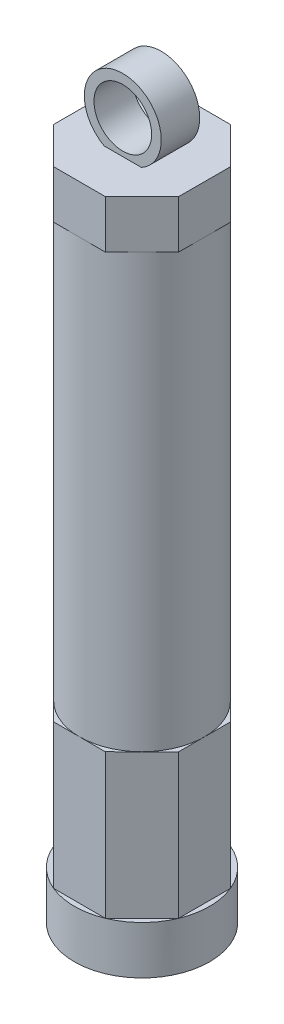
ISO-10303-21;
HEADER;
FILE_DESCRIPTION(('STEP AP214'),'2;1');
FILE_NAME('part.step','',(''),(''),'','','');
FILE_SCHEMA(('AUTOMOTIVE_DESIGN { 1 0 10303 214 1 1 1 1 }'));
ENDSEC;
DATA;
#1=APPLICATION_CONTEXT('core data for automotive mechanical design processes');
#2=APPLICATION_PROTOCOL_DEFINITION('international standard','automotive_design',2000,#1);
#3=PRODUCT_CONTEXT('',#1,'mechanical');
#4=PRODUCT('Part','Part','',(#3));
#5=PRODUCT_RELATED_PRODUCT_CATEGORY('part','',(#4));
#6=PRODUCT_DEFINITION_FORMATION('','',#4);
#7=PRODUCT_DEFINITION_CONTEXT('part definition',#1,'design');
#8=PRODUCT_DEFINITION('design','',#6,#7);
#9=PRODUCT_DEFINITION_SHAPE('','',#8);
#10=(LENGTH_UNIT() NAMED_UNIT(*) SI_UNIT(.MILLI.,.METRE.));
#11=(NAMED_UNIT(*) PLANE_ANGLE_UNIT() SI_UNIT($,.RADIAN.));
#12=(NAMED_UNIT(*) SI_UNIT($,.STERADIAN.) SOLID_ANGLE_UNIT());
#13=UNCERTAINTY_MEASURE_WITH_UNIT(LENGTH_MEASURE(1.E-05),#10,'distance_accuracy_value','');
#14=(GEOMETRIC_REPRESENTATION_CONTEXT(3) GLOBAL_UNCERTAINTY_ASSIGNED_CONTEXT((#13)) GLOBAL_UNIT_ASSIGNED_CONTEXT((#10,
#11,#12)) REPRESENTATION_CONTEXT('',''));
#15=CARTESIAN_POINT('',(0.,0.,0.));
#16=DIRECTION('',(0.,0.,1.));
#17=DIRECTION('',(1.,0.,0.));
#18=AXIS2_PLACEMENT_3D('',#15,#16,#17);
#19=CARTESIAN_POINT('',(0.,50.,0.));
#20=DIRECTION('',(0.,1.,0.));
#21=DIRECTION('',(0.,0.,1.));
#22=AXIS2_PLACEMENT_3D('',#19,#20,#21);
#23=PLANE('',#22);
#24=DIRECTION('',(0.999999236559649,0.,0.0012356699070069));
#25=VECTOR('',#24,1.);
#26=CARTESIAN_POINT('',(-2.70041795434292,50.,6.49666813461608));
#27=LINE('',#26,#25);
#28=CARTESIAN_POINT('',(-2.70041795434292,50.,6.49666813461608));
#29=VERTEX_POINT('',#28);
#30=CARTESIAN_POINT('',(2.6843542455518,50.,6.50332194065936));
#31=VERTEX_POINT('',#30);
#32=EDGE_CURVE('E317',#29,#31,#27,.T.);
#33=ORIENTED_EDGE('',*,*,#32,.T.);
#34=DIRECTION('',(0.707979991923252,0.,-0.706232490782145));
#35=VECTOR('',#34,1.);
#36=CARTESIAN_POINT('',(2.6843542455518,50.,6.50332194065936));
#37=LINE('',#36,#35);
#38=CARTESIAN_POINT('',(6.49666813461607,50.,2.70041795434291));
#39=VERTEX_POINT('',#38);
#40=EDGE_CURVE('E320',#31,#39,#37,.T.);
#41=ORIENTED_EDGE('',*,*,#40,.T.);
#42=DIRECTION('',(0.00123566990700835,0.,-0.999999236559649));
#43=VECTOR('',#42,1.);
#44=CARTESIAN_POINT('',(6.49666813461607,50.,2.70041795434291));
#45=LINE('',#44,#43);
#46=CARTESIAN_POINT('',(6.50332194065936,50.,-2.68435424555181));
#47=VERTEX_POINT('',#46);
#48=EDGE_CURVE('E323',#39,#47,#45,.T.);
#49=ORIENTED_EDGE('',*,*,#48,.T.);
#50=DIRECTION('',(-0.706232490782145,0.,-0.707979991923252));
#51=VECTOR('',#50,1.);
#52=CARTESIAN_POINT('',(6.50332194065936,50.,-2.68435424555181));
#53=LINE('',#52,#51);
#54=CARTESIAN_POINT('',(2.70041795434291,50.,-6.49666813461607));
#55=VERTEX_POINT('',#54);
#56=EDGE_CURVE('E325',#47,#55,#53,.T.);
#57=ORIENTED_EDGE('',*,*,#56,.T.);
#58=DIRECTION('',(-0.999999236559649,0.,-0.00123566990700852));
#59=VECTOR('',#58,1.);
#60=CARTESIAN_POINT('',(2.70041795434291,50.,-6.49666813461607));
#61=LINE('',#60,#59);
#62=CARTESIAN_POINT('',(-2.68435424555181,50.,-6.50332194065936));
#63=VERTEX_POINT('',#62);
#64=EDGE_CURVE('E327',#55,#63,#61,.T.);
#65=ORIENTED_EDGE('',*,*,#64,.T.);
#66=DIRECTION('',(-0.707979991923253,0.,0.706232490782144));
#67=VECTOR('',#66,1.);
#68=CARTESIAN_POINT('',(-2.68435424555181,50.,-6.50332194065936));
#69=LINE('',#68,#67);
#70=CARTESIAN_POINT('',(-6.49666813461608,50.,-2.70041795434292));
#71=VERTEX_POINT('',#70);
#72=EDGE_CURVE('E329',#63,#71,#69,.T.);
#73=ORIENTED_EDGE('',*,*,#72,.T.);
#74=DIRECTION('',(-0.00123566990700803,0.,0.999999236559649));
#75=VECTOR('',#74,1.);
#76=CARTESIAN_POINT('',(-6.49666813461608,50.,-2.70041795434292));
#77=LINE('',#76,#75);
#78=CARTESIAN_POINT('',(-6.50332194065937,50.,2.68435424555181));
#79=VERTEX_POINT('',#78);
#80=EDGE_CURVE('E331',#71,#79,#77,.T.);
#81=ORIENTED_EDGE('',*,*,#80,.T.);
#82=DIRECTION('',(0.706232490782145,0.,0.707979991923252));
#83=VECTOR('',#82,1.);
#84=CARTESIAN_POINT('',(-6.50332194065937,50.,2.68435424555181));
#85=LINE('',#84,#83);
#86=EDGE_CURVE('E333',#79,#29,#85,.T.);
#87=ORIENTED_EDGE('',*,*,#86,.T.);
#88=EDGE_LOOP('',(#33,#41,#49,#57,#65,#73,#81,#87));
#89=FACE_BOUND('',#88,.T.);
#90=DIRECTION('',(1.,0.,0.));
#91=VECTOR('',#90,1.);
#92=CARTESIAN_POINT('',(1.93649167310372,50.,-2.));
#93=LINE('',#92,#91);
#94=CARTESIAN_POINT('',(-1.93649167310372,50.,-2.));
#95=VERTEX_POINT('',#94);
#96=CARTESIAN_POINT('',(1.93649167310372,50.,-2.));
#97=VERTEX_POINT('',#96);
#98=EDGE_CURVE('E215',#95,#97,#93,.T.);
#99=ORIENTED_EDGE('',*,*,#98,.T.);
#100=DIRECTION('',(0.,0.,-1.));
#101=VECTOR('',#100,1.);
#102=CARTESIAN_POINT('',(1.93649167310372,50.,2.));
#103=LINE('',#102,#101);
#104=CARTESIAN_POINT('',(1.93649167310372,50.,2.));
#105=VERTEX_POINT('',#104);
#106=EDGE_CURVE('E223',#105,#97,#103,.T.);
#107=ORIENTED_EDGE('',*,*,#106,.F.);
#108=DIRECTION('',(1.,0.,0.));
#109=VECTOR('',#108,1.);
#110=CARTESIAN_POINT('',(1.93649167310372,50.,2.));
#111=LINE('',#110,#109);
#112=CARTESIAN_POINT('',(-1.93649167310372,50.,2.));
#113=VERTEX_POINT('',#112);
#114=EDGE_CURVE('E213',#113,#105,#111,.T.);
#115=ORIENTED_EDGE('',*,*,#114,.F.);
#116=DIRECTION('',(0.,0.,-1.));
#117=VECTOR('',#116,1.);
#118=CARTESIAN_POINT('',(-1.93649167310372,50.,2.));
#119=LINE('',#118,#117);
#120=EDGE_CURVE('E218',#113,#95,#119,.T.);
#121=ORIENTED_EDGE('',*,*,#120,.T.);
#122=EDGE_LOOP('',(#99,#107,#115,#121));
#123=FACE_BOUND('',#122,.T.);
#124=ADVANCED_FACE('F33',(#89,#123),#23,.T.);
#125=CARTESIAN_POINT('',(0.,45.,0.));
#126=DIRECTION('',(0.,-1.,0.));
#127=DIRECTION('',(0.,0.,-1.));
#128=AXIS2_PLACEMENT_3D('',#125,#126,#127);
#129=CYLINDRICAL_SURFACE('',#128,6.5);
#130=CARTESIAN_POINT('',(0.,45.,0.));
#131=DIRECTION('',(0.,1.,0.));
#132=DIRECTION('',(0.,0.,1.));
#133=AXIS2_PLACEMENT_3D('',#130,#131,#132);
#134=CIRCLE('',#133,6.5);
#135=CARTESIAN_POINT('',(4.59051119008394,45.,4.60186994750114));
#136=VERTEX_POINT('',#135);
#137=CARTESIAN_POINT('',(6.49999503763772,45.,0.0080318543955543));
#138=VERTEX_POINT('',#137);
#139=EDGE_CURVE('E11',#136,#138,#134,.T.);
#140=ORIENTED_EDGE('',*,*,#139,.F.);
#141=CARTESIAN_POINT('',(-0.00803185439554488,45.,6.49999503763772));
#142=VERTEX_POINT('',#141);
#143=EDGE_CURVE('E43',#142,#136,#134,.T.);
#144=ORIENTED_EDGE('',*,*,#143,.F.);
#145=CARTESIAN_POINT('',(-4.60186994750114,45.,4.59051119008395));
#146=VERTEX_POINT('',#145);
#147=EDGE_CURVE('E401',#146,#142,#134,.T.);
#148=ORIENTED_EDGE('',*,*,#147,.F.);
#149=CARTESIAN_POINT('',(-6.49999503763773,45.,-0.00803185439555221));
#150=VERTEX_POINT('',#149);
#151=EDGE_CURVE('E562',#150,#146,#134,.T.);
#152=ORIENTED_EDGE('',*,*,#151,.F.);
#153=CARTESIAN_POINT('',(-4.59051119008394,45.,-4.60186994750115));
#154=VERTEX_POINT('',#153);
#155=EDGE_CURVE('E585',#154,#150,#134,.T.);
#156=ORIENTED_EDGE('',*,*,#155,.F.);
#157=CARTESIAN_POINT('',(0.00803185439555535,45.,-6.49999503763772));
#158=VERTEX_POINT('',#157);
#159=EDGE_CURVE('E586',#158,#154,#134,.T.);
#160=ORIENTED_EDGE('',*,*,#159,.F.);
#161=CARTESIAN_POINT('',(4.60186994750114,45.,-4.59051119008394));
#162=VERTEX_POINT('',#161);
#163=EDGE_CURVE('E591',#162,#158,#134,.T.);
#164=ORIENTED_EDGE('',*,*,#163,.F.);
#165=EDGE_CURVE('E42',#138,#162,#134,.T.);
#166=ORIENTED_EDGE('',*,*,#165,.F.);
#167=EDGE_LOOP('',(#140,#144,#148,#152,#156,#160,#164,#166));
#168=FACE_BOUND('',#167,.T.);
#169=CARTESIAN_POINT('',(0.,0.,0.));
#170=DIRECTION('',(0.,1.,0.));
#171=DIRECTION('',(0.,0.,1.));
#172=AXIS2_PLACEMENT_3D('',#169,#170,#171);
#173=CIRCLE('',#172,6.5);
#174=CARTESIAN_POINT('',(4.59051119008394,0.,4.60186994750113));
#175=VERTEX_POINT('',#174);
#176=CARTESIAN_POINT('',(6.49999503763771,0.,0.00803185439555423));
#177=VERTEX_POINT('',#176);
#178=EDGE_CURVE('E37',#175,#177,#173,.T.);
#179=ORIENTED_EDGE('',*,*,#178,.T.);
#180=CARTESIAN_POINT('',(4.60186994750113,0.,-4.59051119008394));
#181=VERTEX_POINT('',#180);
#182=EDGE_CURVE('E397',#177,#181,#173,.T.);
#183=ORIENTED_EDGE('',*,*,#182,.T.);
#184=CARTESIAN_POINT('',(0.00803185439555336,0.,-6.49999503763771));
#185=VERTEX_POINT('',#184);
#186=EDGE_CURVE('E402',#181,#185,#173,.T.);
#187=ORIENTED_EDGE('',*,*,#186,.T.);
#188=CARTESIAN_POINT('',(-4.59051119008394,0.,-4.60186994750114));
#189=VERTEX_POINT('',#188);
#190=EDGE_CURVE('E404',#185,#189,#173,.T.);
#191=ORIENTED_EDGE('',*,*,#190,.T.);
#192=CARTESIAN_POINT('',(-6.49999503763771,0.,-0.0080318543955564));
#193=VERTEX_POINT('',#192);
#194=EDGE_CURVE('E406',#189,#193,#173,.T.);
#195=ORIENTED_EDGE('',*,*,#194,.T.);
#196=CARTESIAN_POINT('',(-4.60186994750115,0.,4.59051119008393));
#197=VERTEX_POINT('',#196);
#198=EDGE_CURVE('E396',#193,#197,#173,.T.);
#199=ORIENTED_EDGE('',*,*,#198,.T.);
#200=CARTESIAN_POINT('',(-0.00803185439553862,0.,6.49999503763772));
#201=VERTEX_POINT('',#200);
#202=EDGE_CURVE('E392',#197,#201,#173,.T.);
#203=ORIENTED_EDGE('',*,*,#202,.T.);
#204=EDGE_CURVE('E388',#201,#175,#173,.T.);
#205=ORIENTED_EDGE('',*,*,#204,.T.);
#206=EDGE_LOOP('',(#179,#183,#187,#191,#195,#199,#203,#205));
#207=FACE_BOUND('',#206,.T.);
#208=ADVANCED_FACE('F35',(#168,#207),#129,.T.);
#209=CARTESIAN_POINT('',(0.,45.,0.));
#210=DIRECTION('',(0.,1.,0.));
#211=DIRECTION('',(0.,0.,1.));
#212=AXIS2_PLACEMENT_3D('',#209,#210,#211);
#213=PLANE('',#212);
#214=DIRECTION('',(0.707979991923252,0.,-0.706232490782145));
#215=VECTOR('',#214,1.);
#216=CARTESIAN_POINT('',(2.6843542455518,45.,6.50332194065936));
#217=LINE('',#216,#215);
#218=CARTESIAN_POINT('',(6.49666813461607,45.,2.70041795434291));
#219=VERTEX_POINT('',#218);
#220=EDGE_CURVE('E339',#136,#219,#217,.T.);
#221=ORIENTED_EDGE('',*,*,#220,.F.);
#222=ORIENTED_EDGE('',*,*,#139,.T.);
#223=DIRECTION('',(0.00123566990700835,0.,-0.999999236559649));
#224=VECTOR('',#223,1.);
#225=CARTESIAN_POINT('',(6.49666813461607,45.,2.70041795434291));
#226=LINE('',#225,#224);
#227=EDGE_CURVE('E344',#219,#138,#226,.T.);
#228=ORIENTED_EDGE('',*,*,#227,.F.);
#229=EDGE_LOOP('',(#221,#222,#228));
#230=FACE_BOUND('',#229,.T.);
#231=ADVANCED_FACE('F509',(#230),#213,.F.);
#232=CARTESIAN_POINT('',(6.50332194065936,45.,-2.68435424555181));
#233=VERTEX_POINT('',#232);
#234=EDGE_CURVE('E343',#138,#233,#226,.T.);
#235=ORIENTED_EDGE('',*,*,#234,.F.);
#236=ORIENTED_EDGE('',*,*,#165,.T.);
#237=DIRECTION('',(-0.706232490782145,0.,-0.707979991923252));
#238=VECTOR('',#237,1.);
#239=CARTESIAN_POINT('',(6.50332194065936,45.,-2.68435424555181));
#240=LINE('',#239,#238);
#241=EDGE_CURVE('E348',#233,#162,#240,.T.);
#242=ORIENTED_EDGE('',*,*,#241,.F.);
#243=EDGE_LOOP('',(#235,#236,#242));
#244=FACE_BOUND('',#243,.T.);
#245=ADVANCED_FACE('F516',(#244),#213,.F.);
#246=CARTESIAN_POINT('',(2.70041795434291,45.,-6.49666813461607));
#247=VERTEX_POINT('',#246);
#248=EDGE_CURVE('E347',#162,#247,#240,.T.);
#249=ORIENTED_EDGE('',*,*,#248,.F.);
#250=ORIENTED_EDGE('',*,*,#163,.T.);
#251=DIRECTION('',(-0.999999236559649,0.,-0.00123566990700852));
#252=VECTOR('',#251,1.);
#253=CARTESIAN_POINT('',(2.70041795434291,45.,-6.49666813461607));
#254=LINE('',#253,#252);
#255=EDGE_CURVE('E352',#247,#158,#254,.T.);
#256=ORIENTED_EDGE('',*,*,#255,.F.);
#257=EDGE_LOOP('',(#249,#250,#256));
#258=FACE_BOUND('',#257,.T.);
#259=ADVANCED_FACE('F598',(#258),#213,.F.);
#260=CARTESIAN_POINT('',(-2.68435424555181,45.,-6.50332194065936));
#261=VERTEX_POINT('',#260);
#262=EDGE_CURVE('E351',#158,#261,#254,.T.);
#263=ORIENTED_EDGE('',*,*,#262,.F.);
#264=ORIENTED_EDGE('',*,*,#159,.T.);
#265=DIRECTION('',(-0.707979991923253,0.,0.706232490782144));
#266=VECTOR('',#265,1.);
#267=CARTESIAN_POINT('',(-2.68435424555181,45.,-6.50332194065936));
#268=LINE('',#267,#266);
#269=EDGE_CURVE('E356',#261,#154,#268,.T.);
#270=ORIENTED_EDGE('',*,*,#269,.F.);
#271=EDGE_LOOP('',(#263,#264,#270));
#272=FACE_BOUND('',#271,.T.);
#273=ADVANCED_FACE('F599',(#272),#213,.F.);
#274=CARTESIAN_POINT('',(-6.49666813461608,45.,-2.70041795434292));
#275=VERTEX_POINT('',#274);
#276=EDGE_CURVE('E355',#154,#275,#268,.T.);
#277=ORIENTED_EDGE('',*,*,#276,.F.);
#278=ORIENTED_EDGE('',*,*,#155,.T.);
#279=DIRECTION('',(-0.00123566990700803,0.,0.999999236559649));
#280=VECTOR('',#279,1.);
#281=CARTESIAN_POINT('',(-6.49666813461608,45.,-2.70041795434292));
#282=LINE('',#281,#280);
#283=EDGE_CURVE('E360',#275,#150,#282,.T.);
#284=ORIENTED_EDGE('',*,*,#283,.F.);
#285=EDGE_LOOP('',(#277,#278,#284));
#286=FACE_BOUND('',#285,.T.);
#287=ADVANCED_FACE('F602',(#286),#213,.F.);
#288=CARTESIAN_POINT('',(-6.50332194065937,45.,2.68435424555181));
#289=VERTEX_POINT('',#288);
#290=EDGE_CURVE('E359',#150,#289,#282,.T.);
#291=ORIENTED_EDGE('',*,*,#290,.F.);
#292=ORIENTED_EDGE('',*,*,#151,.T.);
#293=DIRECTION('',(0.706232490782145,0.,0.707979991923252));
#294=VECTOR('',#293,1.);
#295=CARTESIAN_POINT('',(-6.50332194065937,45.,2.68435424555181));
#296=LINE('',#295,#294);
#297=EDGE_CURVE('E321',#289,#146,#296,.T.);
#298=ORIENTED_EDGE('',*,*,#297,.F.);
#299=EDGE_LOOP('',(#291,#292,#298));
#300=FACE_BOUND('',#299,.T.);
#301=ADVANCED_FACE('F583',(#300),#213,.F.);
#302=CARTESIAN_POINT('',(-2.70041795434292,45.,6.49666813461608));
#303=VERTEX_POINT('',#302);
#304=EDGE_CURVE('E363',#146,#303,#296,.T.);
#305=ORIENTED_EDGE('',*,*,#304,.F.);
#306=ORIENTED_EDGE('',*,*,#147,.T.);
#307=DIRECTION('',(0.999999236559649,0.,0.0012356699070069));
#308=VECTOR('',#307,1.);
#309=CARTESIAN_POINT('',(-2.70041795434292,45.,6.49666813461608));
#310=LINE('',#309,#308);
#311=EDGE_CURVE('E336',#303,#142,#310,.T.);
#312=ORIENTED_EDGE('',*,*,#311,.F.);
#313=EDGE_LOOP('',(#305,#306,#312));
#314=FACE_BOUND('',#313,.T.);
#315=ADVANCED_FACE('F551',(#314),#213,.F.);
#316=CARTESIAN_POINT('',(2.6843542455518,45.,6.50332194065936));
#317=VERTEX_POINT('',#316);
#318=EDGE_CURVE('E316',#142,#317,#310,.T.);
#319=ORIENTED_EDGE('',*,*,#318,.F.);
#320=ORIENTED_EDGE('',*,*,#143,.T.);
#321=EDGE_CURVE('E340',#317,#136,#217,.T.);
#322=ORIENTED_EDGE('',*,*,#321,.F.);
#323=EDGE_LOOP('',(#319,#320,#322));
#324=FACE_BOUND('',#323,.T.);
#325=ADVANCED_FACE('F518',(#324),#213,.F.);
#326=CARTESIAN_POINT('',(-2.70041795434292,50.,6.49666813461608));
#327=DIRECTION('',(0.0012356699070069,0.,-0.999999236559649));
#328=DIRECTION('',(-0.999999236559649,0.,-0.0012356699070069));
#329=AXIS2_PLACEMENT_3D('',#326,#327,#328);
#330=PLANE('',#329);
#331=ORIENTED_EDGE('',*,*,#311,.T.);
#332=ORIENTED_EDGE('',*,*,#318,.T.);
#333=DIRECTION('',(0.,-1.,0.));
#334=VECTOR('',#333,1.);
#335=CARTESIAN_POINT('',(2.6843542455518,50.,6.50332194065936));
#336=LINE('',#335,#334);
#337=EDGE_CURVE('E386',#31,#317,#336,.T.);
#338=ORIENTED_EDGE('',*,*,#337,.F.);
#339=ORIENTED_EDGE('',*,*,#32,.F.);
#340=DIRECTION('',(0.,-1.,0.));
#341=VECTOR('',#340,1.);
#342=CARTESIAN_POINT('',(-2.70041795434292,50.,6.49666813461608));
#343=LINE('',#342,#341);
#344=EDGE_CURVE('E335',#29,#303,#343,.T.);
#345=ORIENTED_EDGE('',*,*,#344,.T.);
#346=EDGE_LOOP('',(#331,#332,#338,#339,#345));
#347=FACE_BOUND('',#346,.T.);
#348=ADVANCED_FACE('F545',(#347),#330,.F.);
#349=CARTESIAN_POINT('',(2.6843542455518,50.,6.50332194065936));
#350=DIRECTION('',(-0.706232490782145,0.,-0.707979991923252));
#351=DIRECTION('',(-0.707979991923252,0.,0.706232490782145));
#352=AXIS2_PLACEMENT_3D('',#349,#350,#351);
#353=PLANE('',#352);
#354=ORIENTED_EDGE('',*,*,#321,.T.);
#355=ORIENTED_EDGE('',*,*,#220,.T.);
#356=DIRECTION('',(0.,-1.,0.));
#357=VECTOR('',#356,1.);
#358=CARTESIAN_POINT('',(6.49666813461607,50.,2.70041795434291));
#359=LINE('',#358,#357);
#360=EDGE_CURVE('E383',#39,#219,#359,.T.);
#361=ORIENTED_EDGE('',*,*,#360,.F.);
#362=ORIENTED_EDGE('',*,*,#40,.F.);
#363=ORIENTED_EDGE('',*,*,#337,.T.);
#364=EDGE_LOOP('',(#354,#355,#361,#362,#363));
#365=FACE_BOUND('',#364,.T.);
#366=ADVANCED_FACE('F542',(#365),#353,.F.);
#367=CARTESIAN_POINT('',(6.49666813461607,50.,2.70041795434291));
#368=DIRECTION('',(-0.999999236559649,0.,-0.00123566990700835));
#369=DIRECTION('',(-0.00123566990700835,0.,0.999999236559649));
#370=AXIS2_PLACEMENT_3D('',#367,#368,#369);
#371=PLANE('',#370);
#372=ORIENTED_EDGE('',*,*,#227,.T.);
#373=ORIENTED_EDGE('',*,*,#234,.T.);
#374=DIRECTION('',(0.,-1.,0.));
#375=VECTOR('',#374,1.);
#376=CARTESIAN_POINT('',(6.50332194065936,50.,-2.68435424555181));
#377=LINE('',#376,#375);
#378=EDGE_CURVE('E380',#47,#233,#377,.T.);
#379=ORIENTED_EDGE('',*,*,#378,.F.);
#380=ORIENTED_EDGE('',*,*,#48,.F.);
#381=ORIENTED_EDGE('',*,*,#360,.T.);
#382=EDGE_LOOP('',(#372,#373,#379,#380,#381));
#383=FACE_BOUND('',#382,.T.);
#384=ADVANCED_FACE('F538',(#383),#371,.F.);
#385=CARTESIAN_POINT('',(6.50332194065936,50.,-2.68435424555181));
#386=DIRECTION('',(-0.707979991923252,0.,0.706232490782145));
#387=DIRECTION('',(0.706232490782145,0.,0.707979991923252));
#388=AXIS2_PLACEMENT_3D('',#385,#386,#387);
#389=PLANE('',#388);
#390=ORIENTED_EDGE('',*,*,#241,.T.);
#391=ORIENTED_EDGE('',*,*,#248,.T.);
#392=DIRECTION('',(0.,-1.,0.));
#393=VECTOR('',#392,1.);
#394=CARTESIAN_POINT('',(2.70041795434291,50.,-6.49666813461607));
#395=LINE('',#394,#393);
#396=EDGE_CURVE('E377',#55,#247,#395,.T.);
#397=ORIENTED_EDGE('',*,*,#396,.F.);
#398=ORIENTED_EDGE('',*,*,#56,.F.);
#399=ORIENTED_EDGE('',*,*,#378,.T.);
#400=EDGE_LOOP('',(#390,#391,#397,#398,#399));
#401=FACE_BOUND('',#400,.T.);
#402=ADVANCED_FACE('F534',(#401),#389,.F.);
#403=CARTESIAN_POINT('',(2.70041795434291,50.,-6.49666813461607));
#404=DIRECTION('',(-0.00123566990700852,0.,0.999999236559649));
#405=DIRECTION('',(0.999999236559649,0.,0.00123566990700852));
#406=AXIS2_PLACEMENT_3D('',#403,#404,#405);
#407=PLANE('',#406);
#408=ORIENTED_EDGE('',*,*,#255,.T.);
#409=ORIENTED_EDGE('',*,*,#262,.T.);
#410=DIRECTION('',(0.,-1.,0.));
#411=VECTOR('',#410,1.);
#412=CARTESIAN_POINT('',(-2.68435424555181,50.,-6.50332194065936));
#413=LINE('',#412,#411);
#414=EDGE_CURVE('E374',#63,#261,#413,.T.);
#415=ORIENTED_EDGE('',*,*,#414,.F.);
#416=ORIENTED_EDGE('',*,*,#64,.F.);
#417=ORIENTED_EDGE('',*,*,#396,.T.);
#418=EDGE_LOOP('',(#408,#409,#415,#416,#417));
#419=FACE_BOUND('',#418,.T.);
#420=ADVANCED_FACE('F530',(#419),#407,.F.);
#421=CARTESIAN_POINT('',(-2.68435424555181,50.,-6.50332194065936));
#422=DIRECTION('',(0.706232490782144,0.,0.707979991923253));
#423=DIRECTION('',(0.707979991923253,0.,-0.706232490782144));
#424=AXIS2_PLACEMENT_3D('',#421,#422,#423);
#425=PLANE('',#424);
#426=ORIENTED_EDGE('',*,*,#269,.T.);
#427=ORIENTED_EDGE('',*,*,#276,.T.);
#428=DIRECTION('',(0.,-1.,0.));
#429=VECTOR('',#428,1.);
#430=CARTESIAN_POINT('',(-6.49666813461608,50.,-2.70041795434292));
#431=LINE('',#430,#429);
#432=EDGE_CURVE('E371',#71,#275,#431,.T.);
#433=ORIENTED_EDGE('',*,*,#432,.F.);
#434=ORIENTED_EDGE('',*,*,#72,.F.);
#435=ORIENTED_EDGE('',*,*,#414,.T.);
#436=EDGE_LOOP('',(#426,#427,#433,#434,#435));
#437=FACE_BOUND('',#436,.T.);
#438=ADVANCED_FACE('F526',(#437),#425,.F.);
#439=CARTESIAN_POINT('',(-6.49666813461608,50.,-2.70041795434292));
#440=DIRECTION('',(0.999999236559649,0.,0.00123566990700803));
#441=DIRECTION('',(0.00123566990700803,0.,-0.999999236559649));
#442=AXIS2_PLACEMENT_3D('',#439,#440,#441);
#443=PLANE('',#442);
#444=ORIENTED_EDGE('',*,*,#283,.T.);
#445=ORIENTED_EDGE('',*,*,#290,.T.);
#446=DIRECTION('',(0.,-1.,0.));
#447=VECTOR('',#446,1.);
#448=CARTESIAN_POINT('',(-6.50332194065937,50.,2.68435424555181));
#449=LINE('',#448,#447);
#450=EDGE_CURVE('E368',#79,#289,#449,.T.);
#451=ORIENTED_EDGE('',*,*,#450,.F.);
#452=ORIENTED_EDGE('',*,*,#80,.F.);
#453=ORIENTED_EDGE('',*,*,#432,.T.);
#454=EDGE_LOOP('',(#444,#445,#451,#452,#453));
#455=FACE_BOUND('',#454,.T.);
#456=ADVANCED_FACE('F522',(#455),#443,.F.);
#457=CARTESIAN_POINT('',(-6.50332194065937,50.,2.68435424555181));
#458=DIRECTION('',(0.707979991923252,0.,-0.706232490782145));
#459=DIRECTION('',(-0.706232490782145,0.,-0.707979991923252));
#460=AXIS2_PLACEMENT_3D('',#457,#458,#459);
#461=PLANE('',#460);
#462=ORIENTED_EDGE('',*,*,#297,.T.);
#463=ORIENTED_EDGE('',*,*,#304,.T.);
#464=ORIENTED_EDGE('',*,*,#344,.F.);
#465=ORIENTED_EDGE('',*,*,#86,.F.);
#466=ORIENTED_EDGE('',*,*,#450,.T.);
#467=EDGE_LOOP('',(#462,#463,#464,#465,#466));
#468=FACE_BOUND('',#467,.T.);
#469=ADVANCED_FACE('F519',(#468),#461,.F.);
#470=CARTESIAN_POINT('',(0.,0.,0.));
#471=DIRECTION('',(0.,-1.,0.));
#472=DIRECTION('',(0.,0.,-1.));
#473=AXIS2_PLACEMENT_3D('',#470,#471,#472);
#474=PLANE('',#473);
#475=ORIENTED_EDGE('',*,*,#178,.F.);
#476=DIRECTION('',(-0.707979991923252,0.,0.706232490782145));
#477=VECTOR('',#476,1.);
#478=CARTESIAN_POINT('',(6.49666813461607,0.,2.70041795434291));
#479=LINE('',#478,#477);
#480=CARTESIAN_POINT('',(6.49666813461607,0.,2.70041795434291));
#481=VERTEX_POINT('',#480);
#482=EDGE_CURVE('E58',#481,#175,#479,.T.);
#483=ORIENTED_EDGE('',*,*,#482,.F.);
#484=DIRECTION('',(-0.00123566990700819,0.,0.999999236559649));
#485=VECTOR('',#484,1.);
#486=CARTESIAN_POINT('',(6.50332194065936,0.,-2.6843542455518));
#487=LINE('',#486,#485);
#488=EDGE_CURVE('E288',#177,#481,#487,.T.);
#489=ORIENTED_EDGE('',*,*,#488,.F.);
#490=EDGE_LOOP('',(#475,#483,#489));
#491=FACE_BOUND('',#490,.T.);
#492=ADVANCED_FACE('F436',(#491),#474,.F.);
#493=ORIENTED_EDGE('',*,*,#182,.F.);
#494=CARTESIAN_POINT('',(6.50332194065936,0.,-2.6843542455518));
#495=VERTEX_POINT('',#494);
#496=EDGE_CURVE('E289',#495,#177,#487,.T.);
#497=ORIENTED_EDGE('',*,*,#496,.F.);
#498=DIRECTION('',(0.706232490782145,0.,0.707979991923252));
#499=VECTOR('',#498,1.);
#500=CARTESIAN_POINT('',(2.70041795434291,0.,-6.49666813461607));
#501=LINE('',#500,#499);
#502=EDGE_CURVE('E284',#181,#495,#501,.T.);
#503=ORIENTED_EDGE('',*,*,#502,.F.);
#504=EDGE_LOOP('',(#493,#497,#503));
#505=FACE_BOUND('',#504,.T.);
#506=ADVANCED_FACE('F443',(#505),#474,.F.);
#507=ORIENTED_EDGE('',*,*,#186,.F.);
#508=CARTESIAN_POINT('',(2.70041795434291,0.,-6.49666813461607));
#509=VERTEX_POINT('',#508);
#510=EDGE_CURVE('E285',#509,#181,#501,.T.);
#511=ORIENTED_EDGE('',*,*,#510,.F.);
#512=DIRECTION('',(0.999999236559649,0.,0.00123566990700836));
#513=VECTOR('',#512,1.);
#514=CARTESIAN_POINT('',(-2.6843542455518,0.,-6.50332194065936));
#515=LINE('',#514,#513);
#516=EDGE_CURVE('E280',#185,#509,#515,.T.);
#517=ORIENTED_EDGE('',*,*,#516,.F.);
#518=EDGE_LOOP('',(#507,#511,#517));
#519=FACE_BOUND('',#518,.T.);
#520=ADVANCED_FACE('F450',(#519),#474,.F.);
#521=ORIENTED_EDGE('',*,*,#190,.F.);
#522=CARTESIAN_POINT('',(-2.6843542455518,0.,-6.50332194065936));
#523=VERTEX_POINT('',#522);
#524=EDGE_CURVE('E281',#523,#185,#515,.T.);
#525=ORIENTED_EDGE('',*,*,#524,.F.);
#526=DIRECTION('',(0.707979991923252,0.,-0.706232490782145));
#527=VECTOR('',#526,1.);
#528=CARTESIAN_POINT('',(-6.49666813461607,0.,-2.70041795434291));
#529=LINE('',#528,#527);
#530=EDGE_CURVE('E276',#189,#523,#529,.T.);
#531=ORIENTED_EDGE('',*,*,#530,.F.);
#532=EDGE_LOOP('',(#521,#525,#531));
#533=FACE_BOUND('',#532,.T.);
#534=ADVANCED_FACE('F456',(#533),#474,.F.);
#535=ORIENTED_EDGE('',*,*,#194,.F.);
#536=CARTESIAN_POINT('',(-6.49666813461607,0.,-2.70041795434291));
#537=VERTEX_POINT('',#536);
#538=EDGE_CURVE('E277',#537,#189,#529,.T.);
#539=ORIENTED_EDGE('',*,*,#538,.F.);
#540=DIRECTION('',(0.00123566990700852,0.,-0.999999236559649));
#541=VECTOR('',#540,1.);
#542=CARTESIAN_POINT('',(-6.50332194065936,0.,2.68435424555181));
#543=LINE('',#542,#541);
#544=EDGE_CURVE('E272',#193,#537,#543,.T.);
#545=ORIENTED_EDGE('',*,*,#544,.F.);
#546=EDGE_LOOP('',(#535,#539,#545));
#547=FACE_BOUND('',#546,.T.);
#548=ADVANCED_FACE('F416',(#547),#474,.F.);
#549=ORIENTED_EDGE('',*,*,#198,.F.);
#550=CARTESIAN_POINT('',(-6.50332194065936,0.,2.68435424555181));
#551=VERTEX_POINT('',#550);
#552=EDGE_CURVE('E273',#551,#193,#543,.T.);
#553=ORIENTED_EDGE('',*,*,#552,.F.);
#554=DIRECTION('',(-0.706232490782143,0.,-0.707979991923253));
#555=VECTOR('',#554,1.);
#556=CARTESIAN_POINT('',(-2.70041795434292,0.,6.49666813461608));
#557=LINE('',#556,#555);
#558=EDGE_CURVE('E268',#197,#551,#557,.T.);
#559=ORIENTED_EDGE('',*,*,#558,.F.);
#560=EDGE_LOOP('',(#549,#553,#559));
#561=FACE_BOUND('',#560,.T.);
#562=ADVANCED_FACE('F413',(#561),#474,.F.);
#563=ORIENTED_EDGE('',*,*,#202,.F.);
#564=CARTESIAN_POINT('',(-2.70041795434292,0.,6.49666813461608));
#565=VERTEX_POINT('',#564);
#566=EDGE_CURVE('E269',#565,#197,#557,.T.);
#567=ORIENTED_EDGE('',*,*,#566,.F.);
#568=DIRECTION('',(-0.999999236559649,0.,-0.0012356699070061));
#569=VECTOR('',#568,1.);
#570=CARTESIAN_POINT('',(2.6843542455518,0.,6.50332194065936));
#571=LINE('',#570,#569);
#572=EDGE_CURVE('E235',#201,#565,#571,.T.);
#573=ORIENTED_EDGE('',*,*,#572,.F.);
#574=EDGE_LOOP('',(#563,#567,#573));
#575=FACE_BOUND('',#574,.T.);
#576=ADVANCED_FACE('F427',(#575),#474,.F.);
#577=CARTESIAN_POINT('',(2.6843542455518,-15.,6.50332194065936));
#578=DIRECTION('',(0.0012356699070061,0.,-0.999999236559649));
#579=DIRECTION('',(-0.999999236559649,0.,-0.0012356699070061));
#580=AXIS2_PLACEMENT_3D('',#577,#578,#579);
#581=PLANE('',#580);
#582=CARTESIAN_POINT('',(2.6843542455518,0.,6.50332194065936));
#583=VERTEX_POINT('',#582);
#584=EDGE_CURVE('E265',#583,#201,#571,.T.);
#585=ORIENTED_EDGE('',*,*,#584,.T.);
#586=ORIENTED_EDGE('',*,*,#572,.T.);
#587=DIRECTION('',(0.,1.,0.));
#588=VECTOR('',#587,1.);
#589=CARTESIAN_POINT('',(-2.70041795434292,-15.,6.49666813461608));
#590=LINE('',#589,#588);
#591=CARTESIAN_POINT('',(-2.70041795434292,-15.,6.49666813461608));
#592=VERTEX_POINT('',#591);
#593=EDGE_CURVE('E313',#592,#565,#590,.T.);
#594=ORIENTED_EDGE('',*,*,#593,.F.);
#595=DIRECTION('',(-0.999999236559649,0.,-0.0012356699070061));
#596=VECTOR('',#595,1.);
#597=CARTESIAN_POINT('',(2.6843542455518,-15.,6.50332194065936));
#598=LINE('',#597,#596);
#599=CARTESIAN_POINT('',(2.68435424555179,-15.,6.50332194065936));
#600=VERTEX_POINT('',#599);
#601=EDGE_CURVE('E240',#600,#592,#598,.T.);
#602=ORIENTED_EDGE('',*,*,#601,.F.);
#603=DIRECTION('',(0.,1.,0.));
#604=VECTOR('',#603,1.);
#605=CARTESIAN_POINT('',(2.6843542455518,-15.,6.50332194065936));
#606=LINE('',#605,#604);
#607=EDGE_CURVE('E264',#600,#583,#606,.T.);
#608=ORIENTED_EDGE('',*,*,#607,.T.);
#609=EDGE_LOOP('',(#585,#586,#594,#602,#608));
#610=FACE_BOUND('',#609,.T.);
#611=ADVANCED_FACE('F430',(#610),#581,.F.);
#612=CARTESIAN_POINT('',(-2.70041795434292,-15.,6.49666813461608));
#613=DIRECTION('',(0.707979991923253,0.,-0.706232490782143));
#614=DIRECTION('',(-0.706232490782143,0.,-0.707979991923254));
#615=AXIS2_PLACEMENT_3D('',#612,#613,#614);
#616=PLANE('',#615);
#617=ORIENTED_EDGE('',*,*,#566,.T.);
#618=ORIENTED_EDGE('',*,*,#558,.T.);
#619=DIRECTION('',(0.,1.,0.));
#620=VECTOR('',#619,1.);
#621=CARTESIAN_POINT('',(-6.50332194065936,-15.,2.68435424555181));
#622=LINE('',#621,#620);
#623=CARTESIAN_POINT('',(-6.50332194065936,-15.,2.68435424555181));
#624=VERTEX_POINT('',#623);
#625=EDGE_CURVE('E310',#624,#551,#622,.T.);
#626=ORIENTED_EDGE('',*,*,#625,.F.);
#627=DIRECTION('',(-0.706232490782143,0.,-0.707979991923253));
#628=VECTOR('',#627,1.);
#629=CARTESIAN_POINT('',(-2.70041795434292,-15.,6.49666813461608));
#630=LINE('',#629,#628);
#631=EDGE_CURVE('E243',#592,#624,#630,.T.);
#632=ORIENTED_EDGE('',*,*,#631,.F.);
#633=ORIENTED_EDGE('',*,*,#593,.T.);
#634=EDGE_LOOP('',(#617,#618,#626,#632,#633));
#635=FACE_BOUND('',#634,.T.);
#636=ADVANCED_FACE('F422',(#635),#616,.F.);
#637=CARTESIAN_POINT('',(-6.50332194065936,-15.,2.68435424555181));
#638=DIRECTION('',(0.999999236559649,0.,0.00123566990700852));
#639=DIRECTION('',(0.00123566990700852,0.,-0.999999236559649));
#640=AXIS2_PLACEMENT_3D('',#637,#638,#639);
#641=PLANE('',#640);
#642=ORIENTED_EDGE('',*,*,#552,.T.);
#643=ORIENTED_EDGE('',*,*,#544,.T.);
#644=DIRECTION('',(0.,1.,0.));
#645=VECTOR('',#644,1.);
#646=CARTESIAN_POINT('',(-6.49666813461607,-15.,-2.70041795434291));
#647=LINE('',#646,#645);
#648=CARTESIAN_POINT('',(-6.49666813461607,-15.,-2.70041795434291));
#649=VERTEX_POINT('',#648);
#650=EDGE_CURVE('E307',#649,#537,#647,.T.);
#651=ORIENTED_EDGE('',*,*,#650,.F.);
#652=DIRECTION('',(0.00123566990700852,0.,-0.999999236559649));
#653=VECTOR('',#652,1.);
#654=CARTESIAN_POINT('',(-6.50332194065936,-15.,2.68435424555181));
#655=LINE('',#654,#653);
#656=EDGE_CURVE('E246',#624,#649,#655,.T.);
#657=ORIENTED_EDGE('',*,*,#656,.F.);
#658=ORIENTED_EDGE('',*,*,#625,.T.);
#659=EDGE_LOOP('',(#642,#643,#651,#657,#658));
#660=FACE_BOUND('',#659,.T.);
#661=ADVANCED_FACE('F419',(#660),#641,.F.);
#662=CARTESIAN_POINT('',(-6.49666813461607,-15.,-2.70041795434291));
#663=DIRECTION('',(0.706232490782144,0.,0.707979991923252));
#664=DIRECTION('',(0.707979991923252,0.,-0.706232490782145));
#665=AXIS2_PLACEMENT_3D('',#662,#663,#664);
#666=PLANE('',#665);
#667=ORIENTED_EDGE('',*,*,#538,.T.);
#668=ORIENTED_EDGE('',*,*,#530,.T.);
#669=DIRECTION('',(0.,1.,0.));
#670=VECTOR('',#669,1.);
#671=CARTESIAN_POINT('',(-2.6843542455518,-15.,-6.50332194065936));
#672=LINE('',#671,#670);
#673=CARTESIAN_POINT('',(-2.6843542455518,-15.,-6.50332194065936));
#674=VERTEX_POINT('',#673);
#675=EDGE_CURVE('E304',#674,#523,#672,.T.);
#676=ORIENTED_EDGE('',*,*,#675,.F.);
#677=DIRECTION('',(0.707979991923252,0.,-0.706232490782145));
#678=VECTOR('',#677,1.);
#679=CARTESIAN_POINT('',(-6.49666813461607,-15.,-2.70041795434291));
#680=LINE('',#679,#678);
#681=EDGE_CURVE('E249',#649,#674,#680,.T.);
#682=ORIENTED_EDGE('',*,*,#681,.F.);
#683=ORIENTED_EDGE('',*,*,#650,.T.);
#684=EDGE_LOOP('',(#667,#668,#676,#682,#683));
#685=FACE_BOUND('',#684,.T.);
#686=ADVANCED_FACE('F458',(#685),#666,.F.);
#687=CARTESIAN_POINT('',(-2.6843542455518,-15.,-6.50332194065936));
#688=DIRECTION('',(-0.00123566990700836,0.,0.999999236559649));
#689=DIRECTION('',(0.999999236559649,0.,0.00123566990700836));
#690=AXIS2_PLACEMENT_3D('',#687,#688,#689);
#691=PLANE('',#690);
#692=ORIENTED_EDGE('',*,*,#524,.T.);
#693=ORIENTED_EDGE('',*,*,#516,.T.);
#694=DIRECTION('',(0.,1.,0.));
#695=VECTOR('',#694,1.);
#696=CARTESIAN_POINT('',(2.70041795434291,-15.,-6.49666813461607));
#697=LINE('',#696,#695);
#698=CARTESIAN_POINT('',(2.70041795434291,-15.,-6.49666813461607));
#699=VERTEX_POINT('',#698);
#700=EDGE_CURVE('E301',#699,#509,#697,.T.);
#701=ORIENTED_EDGE('',*,*,#700,.F.);
#702=DIRECTION('',(0.999999236559649,0.,0.00123566990700836));
#703=VECTOR('',#702,1.);
#704=CARTESIAN_POINT('',(-2.6843542455518,-15.,-6.50332194065936));
#705=LINE('',#704,#703);
#706=EDGE_CURVE('E252',#674,#699,#705,.T.);
#707=ORIENTED_EDGE('',*,*,#706,.F.);
#708=ORIENTED_EDGE('',*,*,#675,.T.);
#709=EDGE_LOOP('',(#692,#693,#701,#707,#708));
#710=FACE_BOUND('',#709,.T.);
#711=ADVANCED_FACE('F453',(#710),#691,.F.);
#712=CARTESIAN_POINT('',(2.70041795434291,-15.,-6.49666813461607));
#713=DIRECTION('',(-0.707979991923252,0.,0.706232490782145));
#714=DIRECTION('',(0.706232490782145,0.,0.707979991923252));
#715=AXIS2_PLACEMENT_3D('',#712,#713,#714);
#716=PLANE('',#715);
#717=ORIENTED_EDGE('',*,*,#510,.T.);
#718=ORIENTED_EDGE('',*,*,#502,.T.);
#719=DIRECTION('',(0.,1.,0.));
#720=VECTOR('',#719,1.);
#721=CARTESIAN_POINT('',(6.50332194065936,-15.,-2.6843542455518));
#722=LINE('',#721,#720);
#723=CARTESIAN_POINT('',(6.50332194065936,-15.,-2.6843542455518));
#724=VERTEX_POINT('',#723);
#725=EDGE_CURVE('E298',#724,#495,#722,.T.);
#726=ORIENTED_EDGE('',*,*,#725,.F.);
#727=DIRECTION('',(0.706232490782145,0.,0.707979991923252));
#728=VECTOR('',#727,1.);
#729=CARTESIAN_POINT('',(2.70041795434291,-15.,-6.49666813461607));
#730=LINE('',#729,#728);
#731=EDGE_CURVE('E255',#699,#724,#730,.T.);
#732=ORIENTED_EDGE('',*,*,#731,.F.);
#733=ORIENTED_EDGE('',*,*,#700,.T.);
#734=EDGE_LOOP('',(#717,#718,#726,#732,#733));
#735=FACE_BOUND('',#734,.T.);
#736=ADVANCED_FACE('F446',(#735),#716,.F.);
#737=CARTESIAN_POINT('',(6.50332194065936,-15.,-2.6843542455518));
#738=DIRECTION('',(-0.999999236559649,0.,-0.00123566990700819));
#739=DIRECTION('',(-0.00123566990700819,0.,0.999999236559649));
#740=AXIS2_PLACEMENT_3D('',#737,#738,#739);
#741=PLANE('',#740);
#742=ORIENTED_EDGE('',*,*,#496,.T.);
#743=ORIENTED_EDGE('',*,*,#488,.T.);
#744=DIRECTION('',(0.,1.,0.));
#745=VECTOR('',#744,1.);
#746=CARTESIAN_POINT('',(6.49666813461607,-15.,2.70041795434291));
#747=LINE('',#746,#745);
#748=CARTESIAN_POINT('',(6.49666813461607,-15.,2.70041795434291));
#749=VERTEX_POINT('',#748);
#750=EDGE_CURVE('E296',#749,#481,#747,.T.);
#751=ORIENTED_EDGE('',*,*,#750,.F.);
#752=DIRECTION('',(-0.00123566990700819,0.,0.999999236559649));
#753=VECTOR('',#752,1.);
#754=CARTESIAN_POINT('',(6.50332194065936,-15.,-2.6843542455518));
#755=LINE('',#754,#753);
#756=EDGE_CURVE('E258',#724,#749,#755,.T.);
#757=ORIENTED_EDGE('',*,*,#756,.F.);
#758=ORIENTED_EDGE('',*,*,#725,.T.);
#759=EDGE_LOOP('',(#742,#743,#751,#757,#758));
#760=FACE_BOUND('',#759,.T.);
#761=ADVANCED_FACE('F439',(#760),#741,.F.);
#762=CARTESIAN_POINT('',(6.49666813461607,-15.,2.70041795434291));
#763=DIRECTION('',(-0.706232490782145,0.,-0.707979991923252));
#764=DIRECTION('',(-0.707979991923252,0.,0.706232490782145));
#765=AXIS2_PLACEMENT_3D('',#762,#763,#764);
#766=PLANE('',#765);
#767=ORIENTED_EDGE('',*,*,#482,.T.);
#768=EDGE_CURVE('E292',#175,#583,#479,.T.);
#769=ORIENTED_EDGE('',*,*,#768,.T.);
#770=ORIENTED_EDGE('',*,*,#607,.F.);
#771=DIRECTION('',(-0.707979991923252,0.,0.706232490782145));
#772=VECTOR('',#771,1.);
#773=CARTESIAN_POINT('',(6.49666813461607,-15.,2.70041795434291));
#774=LINE('',#773,#772);
#775=EDGE_CURVE('E261',#749,#600,#774,.T.);
#776=ORIENTED_EDGE('',*,*,#775,.F.);
#777=ORIENTED_EDGE('',*,*,#750,.T.);
#778=EDGE_LOOP('',(#767,#769,#770,#776,#777));
#779=FACE_BOUND('',#778,.T.);
#780=ADVANCED_FACE('F689',(#779),#766,.F.);
#781=ORIENTED_EDGE('',*,*,#204,.F.);
#782=ORIENTED_EDGE('',*,*,#584,.F.);
#783=ORIENTED_EDGE('',*,*,#768,.F.);
#784=EDGE_LOOP('',(#781,#782,#783));
#785=FACE_BOUND('',#784,.T.);
#786=ADVANCED_FACE('F433',(#785),#474,.F.);
#787=CARTESIAN_POINT('',(0.,-15.,0.));
#788=DIRECTION('',(0.,-1.,0.));
#789=DIRECTION('',(0.,0.,-1.));
#790=AXIS2_PLACEMENT_3D('',#787,#788,#789);
#791=PLANE('',#790);
#792=CARTESIAN_POINT('',(0.,-15.,0.));
#793=DIRECTION('',(0.,-1.,0.));
#794=DIRECTION('',(0.,0.,-1.));
#795=AXIS2_PLACEMENT_3D('',#792,#793,#794);
#796=CIRCLE('',#795,7.03554930190055);
#797=EDGE_CURVE('E478',#600,#592,#796,.T.);
#798=ORIENTED_EDGE('',*,*,#797,.F.);
#799=ORIENTED_EDGE('',*,*,#601,.T.);
#800=EDGE_LOOP('',(#798,#799));
#801=FACE_BOUND('',#800,.T.);
#802=ADVANCED_FACE('F492',(#801),#791,.F.);
#803=EDGE_CURVE('E477',#592,#624,#796,.T.);
#804=ORIENTED_EDGE('',*,*,#803,.F.);
#805=ORIENTED_EDGE('',*,*,#631,.T.);
#806=EDGE_LOOP('',(#804,#805));
#807=FACE_BOUND('',#806,.T.);
#808=ADVANCED_FACE('F494',(#807),#791,.F.);
#809=EDGE_CURVE('E467',#624,#649,#796,.T.);
#810=ORIENTED_EDGE('',*,*,#809,.F.);
#811=ORIENTED_EDGE('',*,*,#656,.T.);
#812=EDGE_LOOP('',(#810,#811));
#813=FACE_BOUND('',#812,.T.);
#814=ADVANCED_FACE('F465',(#813),#791,.F.);
#815=EDGE_CURVE('E470',#649,#674,#796,.T.);
#816=ORIENTED_EDGE('',*,*,#815,.F.);
#817=ORIENTED_EDGE('',*,*,#681,.T.);
#818=EDGE_LOOP('',(#816,#817));
#819=FACE_BOUND('',#818,.T.);
#820=ADVANCED_FACE('F471',(#819),#791,.F.);
#821=EDGE_CURVE('E222',#674,#699,#796,.T.);
#822=ORIENTED_EDGE('',*,*,#821,.F.);
#823=ORIENTED_EDGE('',*,*,#706,.T.);
#824=EDGE_LOOP('',(#822,#823));
#825=FACE_BOUND('',#824,.T.);
#826=ADVANCED_FACE('F773',(#825),#791,.F.);
#827=EDGE_CURVE('E236',#699,#724,#796,.T.);
#828=ORIENTED_EDGE('',*,*,#827,.F.);
#829=ORIENTED_EDGE('',*,*,#731,.T.);
#830=EDGE_LOOP('',(#828,#829));
#831=FACE_BOUND('',#830,.T.);
#832=ADVANCED_FACE('F781',(#831),#791,.F.);
#833=EDGE_CURVE('E239',#724,#749,#796,.T.);
#834=ORIENTED_EDGE('',*,*,#833,.F.);
#835=ORIENTED_EDGE('',*,*,#756,.T.);
#836=EDGE_LOOP('',(#834,#835));
#837=FACE_BOUND('',#836,.T.);
#838=ADVANCED_FACE('F487',(#837),#791,.F.);
#839=CARTESIAN_POINT('',(0.,-20.,0.));
#840=DIRECTION('',(0.,1.,0.));
#841=DIRECTION('',(0.,0.,1.));
#842=AXIS2_PLACEMENT_3D('',#839,#840,#841);
#843=CYLINDRICAL_SURFACE('',#842,7.03554930190055);
#844=CARTESIAN_POINT('',(0.,-20.,0.));
#845=DIRECTION('',(0.,-1.,0.));
#846=DIRECTION('',(0.,0.,-1.));
#847=AXIS2_PLACEMENT_3D('',#844,#845,#846);
#848=CIRCLE('',#847,7.03554930190055);
#849=CARTESIAN_POINT('',(0.,-20.,-7.03554930190055));
#850=VERTEX_POINT('',#849);
#851=EDGE_CURVE('E232',#850,#850,#848,.T.);
#852=ORIENTED_EDGE('',*,*,#851,.F.);
#853=EDGE_LOOP('',(#852));
#854=FACE_BOUND('',#853,.T.);
#855=ORIENTED_EDGE('',*,*,#827,.T.);
#856=ORIENTED_EDGE('',*,*,#833,.T.);
#857=EDGE_CURVE('E479',#749,#600,#796,.T.);
#858=ORIENTED_EDGE('',*,*,#857,.T.);
#859=ORIENTED_EDGE('',*,*,#797,.T.);
#860=ORIENTED_EDGE('',*,*,#803,.T.);
#861=ORIENTED_EDGE('',*,*,#809,.T.);
#862=ORIENTED_EDGE('',*,*,#815,.T.);
#863=ORIENTED_EDGE('',*,*,#821,.T.);
#864=EDGE_LOOP('',(#855,#856,#858,#859,#860,#861,#862,#863));
#865=FACE_BOUND('',#864,.T.);
#866=ADVANCED_FACE('F474',(#854,#865),#843,.T.);
#867=CARTESIAN_POINT('',(0.,-20.,0.));
#868=DIRECTION('',(0.,-1.,0.));
#869=DIRECTION('',(0.,0.,-1.));
#870=AXIS2_PLACEMENT_3D('',#867,#868,#869);
#871=PLANE('',#870);
#872=ORIENTED_EDGE('',*,*,#851,.T.);
#873=EDGE_LOOP('',(#872));
#874=FACE_BOUND('',#873,.T.);
#875=ADVANCED_FACE('F805',(#874),#871,.T.);
#876=ORIENTED_EDGE('',*,*,#857,.F.);
#877=ORIENTED_EDGE('',*,*,#775,.T.);
#878=EDGE_LOOP('',(#876,#877));
#879=FACE_BOUND('',#878,.T.);
#880=ADVANCED_FACE('F489',(#879),#791,.F.);
#881=CARTESIAN_POINT('',(0.,53.5,2.));
#882=DIRECTION('',(0.,0.,1.));
#883=DIRECTION('',(1.,0.,0.));
#884=AXIS2_PLACEMENT_3D('',#881,#882,#883);
#885=PLANE('',#884);
#886=CARTESIAN_POINT('',(0.,53.5,2.));
#887=DIRECTION('',(0.,0.,1.));
#888=DIRECTION('',(1.,0.,0.));
#889=AXIS2_PLACEMENT_3D('',#886,#887,#888);
#890=CIRCLE('',#889,4.);
#891=EDGE_CURVE('E209',#105,#113,#890,.T.);
#892=ORIENTED_EDGE('',*,*,#891,.T.);
#893=ORIENTED_EDGE('',*,*,#114,.T.);
#894=EDGE_LOOP('',(#892,#893));
#895=FACE_BOUND('',#894,.T.);
#896=CARTESIAN_POINT('',(0.,53.5,2.));
#897=DIRECTION('',(0.,0.,1.));
#898=DIRECTION('',(1.,0.,0.));
#899=AXIS2_PLACEMENT_3D('',#896,#897,#898);
#900=CIRCLE('',#899,3.);
#901=CARTESIAN_POINT('',(3.,53.5,2.));
#902=VERTEX_POINT('',#901);
#903=EDGE_CURVE('E230',#902,#902,#900,.T.);
#904=ORIENTED_EDGE('',*,*,#903,.F.);
#905=EDGE_LOOP('',(#904));
#906=FACE_BOUND('',#905,.T.);
#907=ADVANCED_FACE('F210',(#895,#906),#885,.T.);
#908=CARTESIAN_POINT('',(0.,53.5,-2.));
#909=DIRECTION('',(0.,0.,1.));
#910=DIRECTION('',(1.,0.,0.));
#911=AXIS2_PLACEMENT_3D('',#908,#909,#910);
#912=PLANE('',#911);
#913=CARTESIAN_POINT('',(0.,53.5,-2.));
#914=DIRECTION('',(0.,0.,1.));
#915=DIRECTION('',(1.,0.,0.));
#916=AXIS2_PLACEMENT_3D('',#913,#914,#915);
#917=CIRCLE('',#916,4.);
#918=EDGE_CURVE('E50',#97,#95,#917,.T.);
#919=ORIENTED_EDGE('',*,*,#918,.F.);
#920=ORIENTED_EDGE('',*,*,#98,.F.);
#921=EDGE_LOOP('',(#919,#920));
#922=FACE_BOUND('',#921,.T.);
#923=CARTESIAN_POINT('',(0.,53.5,-2.));
#924=DIRECTION('',(0.,0.,1.));
#925=DIRECTION('',(1.,0.,0.));
#926=AXIS2_PLACEMENT_3D('',#923,#924,#925);
#927=CIRCLE('',#926,3.);
#928=CARTESIAN_POINT('',(3.,53.5,-2.));
#929=VERTEX_POINT('',#928);
#930=EDGE_CURVE('E869',#929,#929,#927,.T.);
#931=ORIENTED_EDGE('',*,*,#930,.T.);
#932=EDGE_LOOP('',(#931));
#933=FACE_BOUND('',#932,.T.);
#934=ADVANCED_FACE('F833',(#922,#933),#912,.F.);
#935=CARTESIAN_POINT('',(0.,53.5,2.));
#936=DIRECTION('',(0.,0.,-1.));
#937=DIRECTION('',(-1.,0.,0.));
#938=AXIS2_PLACEMENT_3D('',#935,#936,#937);
#939=CYLINDRICAL_SURFACE('',#938,4.);
#940=ORIENTED_EDGE('',*,*,#918,.T.);
#941=ORIENTED_EDGE('',*,*,#120,.F.);
#942=ORIENTED_EDGE('',*,*,#891,.F.);
#943=ORIENTED_EDGE('',*,*,#106,.T.);
#944=EDGE_LOOP('',(#940,#941,#942,#943));
#945=FACE_BOUND('',#944,.T.);
#946=ADVANCED_FACE('F219',(#945),#939,.T.);
#947=CARTESIAN_POINT('',(0.,53.5,2.));
#948=DIRECTION('',(0.,0.,-1.));
#949=DIRECTION('',(-1.,0.,0.));
#950=AXIS2_PLACEMENT_3D('',#947,#948,#949);
#951=CYLINDRICAL_SURFACE('',#950,3.);
#952=ORIENTED_EDGE('',*,*,#903,.T.);
#953=EDGE_LOOP('',(#952));
#954=FACE_BOUND('',#953,.T.);
#955=ORIENTED_EDGE('',*,*,#930,.F.);
#956=EDGE_LOOP('',(#955));
#957=FACE_BOUND('',#956,.T.);
#958=ADVANCED_FACE('F851',(#954,#957),#951,.F.);
#959=CLOSED_SHELL('',(#124,#208,#231,#245,#259,#273,#287,#301,#315,#325,#348,#366,#384,#402,
#420,#438,#456,#469,#492,#506,#520,#534,#548,#562,#576,#611,#636,#661,#686,#711,#736,#761,#780,
#786,#802,#808,#814,#820,#826,#832,#838,#866,#875,#880,#907,#934,#946,#958));
#960=MANIFOLD_SOLID_BREP('B2',#959);
#961=ADVANCED_BREP_SHAPE_REPRESENTATION('',(#18,#960),#14);
#962=SHAPE_DEFINITION_REPRESENTATION(#9,#961);
ENDSEC;
END-ISO-10303-21;
